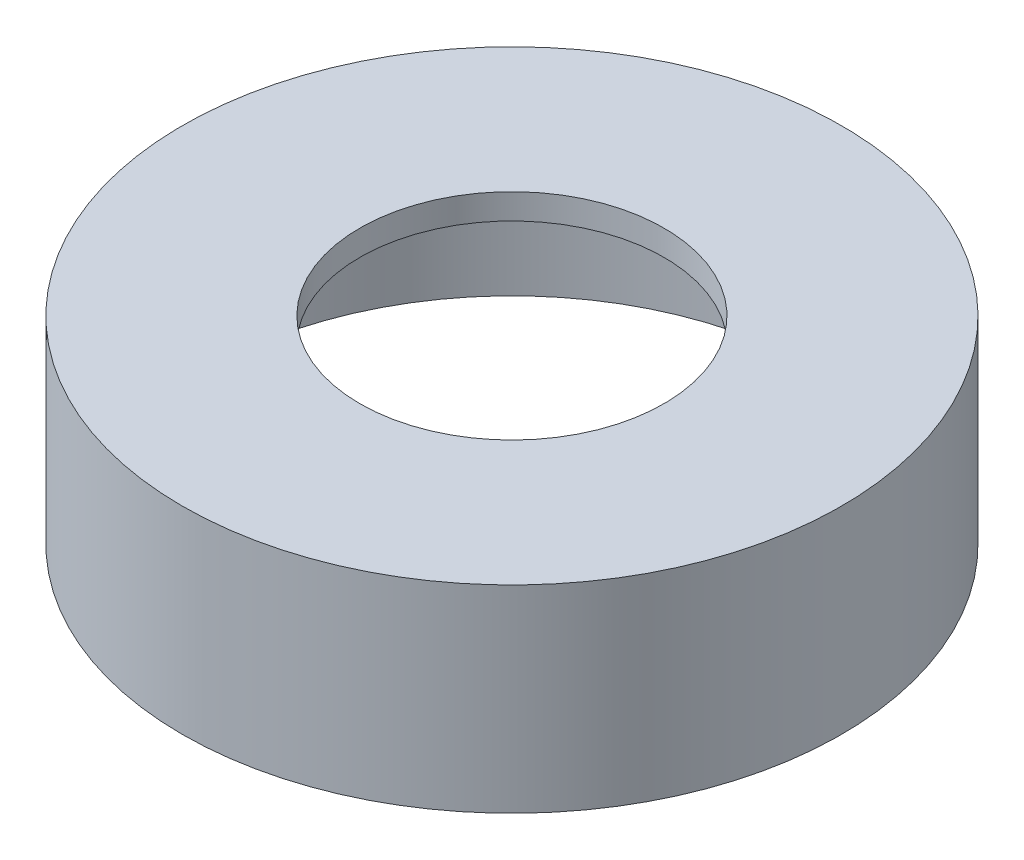
ISO-10303-21;
HEADER;
FILE_DESCRIPTION(('STEP AP214'),'2;1');
FILE_NAME('part.step','',(''),(''),'','','');
FILE_SCHEMA(('AUTOMOTIVE_DESIGN { 1 0 10303 214 1 1 1 1 }'));
ENDSEC;
DATA;
#1=APPLICATION_CONTEXT('core data for automotive mechanical design processes');
#2=APPLICATION_PROTOCOL_DEFINITION('international standard','automotive_design',2000,#1);
#3=PRODUCT_CONTEXT('',#1,'mechanical');
#4=PRODUCT('Part','Part','',(#3));
#5=PRODUCT_RELATED_PRODUCT_CATEGORY('part','',(#4));
#6=PRODUCT_DEFINITION_FORMATION('','',#4);
#7=PRODUCT_DEFINITION_CONTEXT('part definition',#1,'design');
#8=PRODUCT_DEFINITION('design','',#6,#7);
#9=PRODUCT_DEFINITION_SHAPE('','',#8);
#10=(LENGTH_UNIT() NAMED_UNIT(*) SI_UNIT(.MILLI.,.METRE.));
#11=(NAMED_UNIT(*) PLANE_ANGLE_UNIT() SI_UNIT($,.RADIAN.));
#12=(NAMED_UNIT(*) SI_UNIT($,.STERADIAN.) SOLID_ANGLE_UNIT());
#13=UNCERTAINTY_MEASURE_WITH_UNIT(LENGTH_MEASURE(1.E-05),#10,'distance_accuracy_value','');
#14=(GEOMETRIC_REPRESENTATION_CONTEXT(3) GLOBAL_UNCERTAINTY_ASSIGNED_CONTEXT((#13)) GLOBAL_UNIT_ASSIGNED_CONTEXT((#10,
#11,#12)) REPRESENTATION_CONTEXT('',''));
#15=CARTESIAN_POINT('',(0.,0.,0.));
#16=DIRECTION('',(0.,0.,1.));
#17=DIRECTION('',(1.,0.,0.));
#18=AXIS2_PLACEMENT_3D('',#15,#16,#17);
#19=CARTESIAN_POINT('',(0.,19.5,0.));
#20=DIRECTION('',(0.,-1.,0.));
#21=DIRECTION('',(0.,0.,-1.));
#22=AXIS2_PLACEMENT_3D('',#19,#20,#21);
#23=CYLINDRICAL_SURFACE('',#22,30.);
#24=CARTESIAN_POINT('',(0.,17.,0.));
#25=DIRECTION('',(0.,1.,0.));
#26=DIRECTION('',(0.,0.,1.));
#27=AXIS2_PLACEMENT_3D('',#24,#25,#26);
#28=CIRCLE('',#27,30.);
#29=CARTESIAN_POINT('',(0.,17.,30.));
#30=VERTEX_POINT('',#29);
#31=EDGE_CURVE('E239',#30,#30,#28,.T.);
#32=ORIENTED_EDGE('',*,*,#31,.T.);
#33=EDGE_LOOP('',(#32));
#34=FACE_BOUND('',#33,.T.);
#35=CARTESIAN_POINT('',(0.,0.,0.));
#36=DIRECTION('',(0.,1.,0.));
#37=DIRECTION('',(0.,0.,1.));
#38=AXIS2_PLACEMENT_3D('',#35,#36,#37);
#39=CIRCLE('',#38,30.);
#40=CARTESIAN_POINT('',(0.,0.,30.));
#41=VERTEX_POINT('',#40);
#42=EDGE_CURVE('E243',#41,#41,#39,.T.);
#43=ORIENTED_EDGE('',*,*,#42,.F.);
#44=EDGE_LOOP('',(#43));
#45=FACE_BOUND('',#44,.T.);
#46=CARTESIAN_POINT('',(0.,4.,0.));
#47=DIRECTION('',(0.,1.,0.));
#48=DIRECTION('',(0.,0.,1.));
#49=AXIS2_PLACEMENT_3D('',#46,#47,#48);
#50=CIRCLE('',#49,30.);
#51=CARTESIAN_POINT('',(-1.5,4.,29.9624765331573));
#52=VERTEX_POINT('',#51);
#53=CARTESIAN_POINT('',(1.5,4.,29.9624765331573));
#54=VERTEX_POINT('',#53);
#55=EDGE_CURVE('E258',#52,#54,#50,.T.);
#56=ORIENTED_EDGE('',*,*,#55,.T.);
#57=DIRECTION('',(0.,-1.,0.));
#58=VECTOR('',#57,1.);
#59=CARTESIAN_POINT('',(1.5,19.5,29.9624765331573));
#60=LINE('',#59,#58);
#61=CARTESIAN_POINT('',(1.5,7.96050161384976,29.9624765331573));
#62=VERTEX_POINT('',#61);
#63=EDGE_CURVE('E260',#54,#62,#60,.F.);
#64=ORIENTED_EDGE('',*,*,#63,.T.);
#65=CARTESIAN_POINT('',(0.,-23.5789473684211,0.));
#66=DIRECTION('',(0.,-0.688749461914693,0.724999433594414));
#67=DIRECTION('',(0.,-0.724999433594414,-0.688749461914693));
#68=AXIS2_PLACEMENT_3D('',#65,#66,#67);
#69=ELLIPSE('',#68,43.5572028130539,30.);
#70=CARTESIAN_POINT('',(-1.5,7.96050161384975,29.9624765331573));
#71=VERTEX_POINT('',#70);
#72=EDGE_CURVE('E256',#62,#71,#69,.T.);
#73=ORIENTED_EDGE('',*,*,#72,.T.);
#74=DIRECTION('',(0.,-1.,0.));
#75=VECTOR('',#74,1.);
#76=CARTESIAN_POINT('',(-1.5,19.5,29.9624765331573));
#77=LINE('',#76,#75);
#78=EDGE_CURVE('E249',#52,#71,#77,.F.);
#79=ORIENTED_EDGE('',*,*,#78,.F.);
#80=EDGE_LOOP('',(#56,#64,#73,#79));
#81=FACE_BOUND('',#80,.T.);
#82=CARTESIAN_POINT('',(0.,4.,0.));
#83=DIRECTION('',(0.,1.,0.));
#84=DIRECTION('',(0.,0.,1.));
#85=AXIS2_PLACEMENT_3D('',#82,#83,#84);
#86=CIRCLE('',#85,30.);
#87=CARTESIAN_POINT('',(29.9624765331573,4.,1.4999999999999));
#88=VERTEX_POINT('',#87);
#89=CARTESIAN_POINT('',(29.9624765331573,4.,-1.5000000000001));
#90=VERTEX_POINT('',#89);
#91=EDGE_CURVE('E268',#88,#90,#86,.T.);
#92=ORIENTED_EDGE('',*,*,#91,.T.);
#93=DIRECTION('',(0.,-1.,0.));
#94=VECTOR('',#93,1.);
#95=CARTESIAN_POINT('',(29.9624765331573,19.5,-1.5000000000001));
#96=LINE('',#95,#94);
#97=CARTESIAN_POINT('',(29.9624765331573,7.96050161384976,-1.5000000000001));
#98=VERTEX_POINT('',#97);
#99=EDGE_CURVE('E270',#90,#98,#96,.F.);
#100=ORIENTED_EDGE('',*,*,#99,.T.);
#101=CARTESIAN_POINT('',(0.,-23.5789473684211,0.));
#102=DIRECTION('',(0.724999433594414,-0.688749461914693,0.));
#103=DIRECTION('',(-0.688749461914693,-0.724999433594414,0.));
#104=AXIS2_PLACEMENT_3D('',#101,#102,#103);
#105=ELLIPSE('',#104,43.5572028130539,30.);
#106=CARTESIAN_POINT('',(29.9624765331573,7.96050161384975,1.4999999999999));
#107=VERTEX_POINT('',#106);
#108=EDGE_CURVE('E266',#98,#107,#105,.T.);
#109=ORIENTED_EDGE('',*,*,#108,.T.);
#110=DIRECTION('',(0.,-1.,0.));
#111=VECTOR('',#110,1.);
#112=CARTESIAN_POINT('',(29.9624765331573,19.5,1.4999999999999));
#113=LINE('',#112,#111);
#114=EDGE_CURVE('E263',#88,#107,#113,.F.);
#115=ORIENTED_EDGE('',*,*,#114,.F.);
#116=EDGE_LOOP('',(#92,#100,#109,#115));
#117=FACE_BOUND('',#116,.T.);
#118=CARTESIAN_POINT('',(0.,4.,0.));
#119=DIRECTION('',(0.,1.,0.));
#120=DIRECTION('',(0.,0.,1.));
#121=AXIS2_PLACEMENT_3D('',#118,#119,#120);
#122=CIRCLE('',#121,30.);
#123=CARTESIAN_POINT('',(1.5,4.,-29.9624765331573));
#124=VERTEX_POINT('',#123);
#125=CARTESIAN_POINT('',(-1.5,4.,-29.9624765331573));
#126=VERTEX_POINT('',#125);
#127=EDGE_CURVE('E278',#124,#126,#122,.T.);
#128=ORIENTED_EDGE('',*,*,#127,.T.);
#129=DIRECTION('',(0.,-1.,0.));
#130=VECTOR('',#129,1.);
#131=CARTESIAN_POINT('',(-1.5,19.5,-29.9624765331573));
#132=LINE('',#131,#130);
#133=CARTESIAN_POINT('',(-1.5,7.96050161384976,-29.9624765331573));
#134=VERTEX_POINT('',#133);
#135=EDGE_CURVE('E280',#126,#134,#132,.F.);
#136=ORIENTED_EDGE('',*,*,#135,.T.);
#137=CARTESIAN_POINT('',(0.,-23.5789473684211,0.));
#138=DIRECTION('',(0.,-0.688749461914693,-0.724999433594414));
#139=DIRECTION('',(0.,-0.724999433594414,0.688749461914693));
#140=AXIS2_PLACEMENT_3D('',#137,#138,#139);
#141=ELLIPSE('',#140,43.5572028130539,30.);
#142=CARTESIAN_POINT('',(1.5,7.96050161384975,-29.9624765331573));
#143=VERTEX_POINT('',#142);
#144=EDGE_CURVE('E276',#134,#143,#141,.T.);
#145=ORIENTED_EDGE('',*,*,#144,.T.);
#146=DIRECTION('',(0.,-1.,0.));
#147=VECTOR('',#146,1.);
#148=CARTESIAN_POINT('',(1.5,19.5,-29.9624765331573));
#149=LINE('',#148,#147);
#150=EDGE_CURVE('E273',#124,#143,#149,.F.);
#151=ORIENTED_EDGE('',*,*,#150,.F.);
#152=EDGE_LOOP('',(#128,#136,#145,#151));
#153=FACE_BOUND('',#152,.T.);
#154=CARTESIAN_POINT('',(0.,4.,0.));
#155=DIRECTION('',(0.,1.,0.));
#156=DIRECTION('',(0.,0.,1.));
#157=AXIS2_PLACEMENT_3D('',#154,#155,#156);
#158=CIRCLE('',#157,30.);
#159=CARTESIAN_POINT('',(-29.9624765331573,4.,-1.49999999999969));
#160=VERTEX_POINT('',#159);
#161=CARTESIAN_POINT('',(-29.9624765331572,4.,1.50000000000031));
#162=VERTEX_POINT('',#161);
#163=EDGE_CURVE('E42',#160,#162,#158,.T.);
#164=ORIENTED_EDGE('',*,*,#163,.T.);
#165=DIRECTION('',(0.,-1.,0.));
#166=VECTOR('',#165,1.);
#167=CARTESIAN_POINT('',(-29.9624765331572,19.5,1.50000000000031));
#168=LINE('',#167,#166);
#169=CARTESIAN_POINT('',(-29.9624765331573,7.96050161384976,1.50000000000031));
#170=VERTEX_POINT('',#169);
#171=EDGE_CURVE('E11',#162,#170,#168,.F.);
#172=ORIENTED_EDGE('',*,*,#171,.T.);
#173=CARTESIAN_POINT('',(0.,-23.5789473684211,0.));
#174=DIRECTION('',(-0.724999433594414,-0.688749461914693,0.));
#175=DIRECTION('',(0.688749461914693,-0.724999433594414,0.));
#176=AXIS2_PLACEMENT_3D('',#173,#174,#175);
#177=ELLIPSE('',#176,43.5572028130539,30.);
#178=CARTESIAN_POINT('',(-29.9624765331573,7.96050161384975,-1.49999999999969));
#179=VERTEX_POINT('',#178);
#180=EDGE_CURVE('E55',#170,#179,#177,.T.);
#181=ORIENTED_EDGE('',*,*,#180,.T.);
#182=DIRECTION('',(0.,-1.,0.));
#183=VECTOR('',#182,1.);
#184=CARTESIAN_POINT('',(-29.9624765331573,19.5,-1.49999999999969));
#185=LINE('',#184,#183);
#186=EDGE_CURVE('E283',#160,#179,#185,.F.);
#187=ORIENTED_EDGE('',*,*,#186,.F.);
#188=EDGE_LOOP('',(#164,#172,#181,#187));
#189=FACE_BOUND('',#188,.T.);
#190=ADVANCED_FACE('F34',(#34,#45,#81,#117,#153,#189),#23,.F.);
#191=CARTESIAN_POINT('',(0.,19.5,0.));
#192=DIRECTION('',(0.,-1.,0.));
#193=DIRECTION('',(0.,0.,-1.));
#194=AXIS2_PLACEMENT_3D('',#191,#192,#193);
#195=CYLINDRICAL_SURFACE('',#194,32.5);
#196=CARTESIAN_POINT('',(0.,19.5,0.));
#197=DIRECTION('',(0.,1.,0.));
#198=DIRECTION('',(0.,0.,1.));
#199=AXIS2_PLACEMENT_3D('',#196,#197,#198);
#200=CIRCLE('',#199,32.5);
#201=CARTESIAN_POINT('',(0.,19.5,32.5));
#202=VERTEX_POINT('',#201);
#203=EDGE_CURVE('E246',#202,#202,#200,.T.);
#204=ORIENTED_EDGE('',*,*,#203,.F.);
#205=EDGE_LOOP('',(#204));
#206=FACE_BOUND('',#205,.T.);
#207=CARTESIAN_POINT('',(0.,0.,0.));
#208=DIRECTION('',(0.,1.,0.));
#209=DIRECTION('',(0.,0.,1.));
#210=AXIS2_PLACEMENT_3D('',#207,#208,#209);
#211=CIRCLE('',#210,32.5);
#212=CARTESIAN_POINT('',(0.,0.,32.5));
#213=VERTEX_POINT('',#212);
#214=EDGE_CURVE('E242',#213,#213,#211,.T.);
#215=ORIENTED_EDGE('',*,*,#214,.T.);
#216=EDGE_LOOP('',(#215));
#217=FACE_BOUND('',#216,.T.);
#218=ADVANCED_FACE('F36',(#206,#217),#195,.T.);
#219=CARTESIAN_POINT('',(0.,19.5,0.));
#220=DIRECTION('',(0.,1.,0.));
#221=DIRECTION('',(0.,0.,1.));
#222=AXIS2_PLACEMENT_3D('',#219,#220,#221);
#223=PLANE('',#222);
#224=CARTESIAN_POINT('',(0.,19.5,0.));
#225=DIRECTION('',(0.,1.,0.));
#226=DIRECTION('',(0.,0.,1.));
#227=AXIS2_PLACEMENT_3D('',#224,#225,#226);
#228=CIRCLE('',#227,15.);
#229=CARTESIAN_POINT('',(0.,19.5,15.));
#230=VERTEX_POINT('',#229);
#231=EDGE_CURVE('E235',#230,#230,#228,.T.);
#232=ORIENTED_EDGE('',*,*,#231,.F.);
#233=EDGE_LOOP('',(#232));
#234=FACE_BOUND('',#233,.T.);
#235=ORIENTED_EDGE('',*,*,#203,.T.);
#236=EDGE_LOOP('',(#235));
#237=FACE_BOUND('',#236,.T.);
#238=ADVANCED_FACE('F306',(#234,#237),#223,.T.);
#239=CARTESIAN_POINT('',(0.,0.,0.));
#240=DIRECTION('',(0.,1.,0.));
#241=DIRECTION('',(0.,0.,1.));
#242=AXIS2_PLACEMENT_3D('',#239,#240,#241);
#243=PLANE('',#242);
#244=ORIENTED_EDGE('',*,*,#42,.T.);
#245=EDGE_LOOP('',(#244));
#246=FACE_BOUND('',#245,.T.);
#247=ORIENTED_EDGE('',*,*,#214,.F.);
#248=EDGE_LOOP('',(#247));
#249=FACE_BOUND('',#248,.T.);
#250=ADVANCED_FACE('F316',(#246,#249),#243,.F.);
#251=CARTESIAN_POINT('',(0.,17.,0.));
#252=DIRECTION('',(0.,1.,0.));
#253=DIRECTION('',(0.,0.,1.));
#254=AXIS2_PLACEMENT_3D('',#251,#252,#253);
#255=PLANE('',#254);
#256=CARTESIAN_POINT('',(0.,17.,0.));
#257=DIRECTION('',(0.,1.,0.));
#258=DIRECTION('',(0.,0.,1.));
#259=AXIS2_PLACEMENT_3D('',#256,#257,#258);
#260=CIRCLE('',#259,15.);
#261=CARTESIAN_POINT('',(0.,17.,15.));
#262=VERTEX_POINT('',#261);
#263=EDGE_CURVE('E238',#262,#262,#260,.T.);
#264=ORIENTED_EDGE('',*,*,#263,.T.);
#265=EDGE_LOOP('',(#264));
#266=FACE_BOUND('',#265,.T.);
#267=ORIENTED_EDGE('',*,*,#31,.F.);
#268=EDGE_LOOP('',(#267));
#269=FACE_BOUND('',#268,.T.);
#270=ADVANCED_FACE('F313',(#266,#269),#255,.F.);
#271=CARTESIAN_POINT('',(0.,0.,0.));
#272=DIRECTION('',(0.,1.,0.));
#273=DIRECTION('',(0.,0.,1.));
#274=AXIS2_PLACEMENT_3D('',#271,#272,#273);
#275=CYLINDRICAL_SURFACE('',#274,15.);
#276=ORIENTED_EDGE('',*,*,#231,.T.);
#277=EDGE_LOOP('',(#276));
#278=FACE_BOUND('',#277,.T.);
#279=ORIENTED_EDGE('',*,*,#263,.F.);
#280=EDGE_LOOP('',(#279));
#281=FACE_BOUND('',#280,.T.);
#282=ADVANCED_FACE('F311',(#278,#281),#275,.F.);
#283=CARTESIAN_POINT('',(1.5,4.,30.));
#284=DIRECTION('',(0.,1.,0.));
#285=DIRECTION('',(0.,0.,1.));
#286=AXIS2_PLACEMENT_3D('',#283,#284,#285);
#287=PLANE('',#286);
#288=DIRECTION('',(0.,0.,-1.));
#289=VECTOR('',#288,1.);
#290=CARTESIAN_POINT('',(1.5,4.,30.));
#291=LINE('',#290,#289);
#292=CARTESIAN_POINT('',(1.5,4.,28.1));
#293=VERTEX_POINT('',#292);
#294=EDGE_CURVE('E216',#54,#293,#291,.T.);
#295=ORIENTED_EDGE('',*,*,#294,.F.);
#296=ORIENTED_EDGE('',*,*,#55,.F.);
#297=DIRECTION('',(0.,0.,-1.));
#298=VECTOR('',#297,1.);
#299=CARTESIAN_POINT('',(-1.5,4.,30.));
#300=LINE('',#299,#298);
#301=CARTESIAN_POINT('',(-1.5,4.,28.1));
#302=VERTEX_POINT('',#301);
#303=EDGE_CURVE('E215',#52,#302,#300,.T.);
#304=ORIENTED_EDGE('',*,*,#303,.T.);
#305=DIRECTION('',(-1.,0.,0.));
#306=VECTOR('',#305,1.);
#307=CARTESIAN_POINT('',(1.5,4.,28.1));
#308=LINE('',#307,#306);
#309=EDGE_CURVE('E232',#293,#302,#308,.T.);
#310=ORIENTED_EDGE('',*,*,#309,.F.);
#311=EDGE_LOOP('',(#295,#296,#304,#310));
#312=FACE_BOUND('',#311,.T.);
#313=ADVANCED_FACE('F399',(#312),#287,.F.);
#314=CARTESIAN_POINT('',(1.5,8.,30.));
#315=DIRECTION('',(0.,-0.688749461914693,0.724999433594414));
#316=DIRECTION('',(0.,-0.724999433594414,-0.688749461914693));
#317=AXIS2_PLACEMENT_3D('',#314,#315,#316);
#318=PLANE('',#317);
#319=ORIENTED_EDGE('',*,*,#72,.F.);
#320=DIRECTION('',(0.,0.724999433594414,0.688749461914693));
#321=VECTOR('',#320,1.);
#322=CARTESIAN_POINT('',(1.5,8.,30.));
#323=LINE('',#322,#321);
#324=CARTESIAN_POINT('',(1.5,6.,28.1));
#325=VERTEX_POINT('',#324);
#326=EDGE_CURVE('E221',#325,#62,#323,.T.);
#327=ORIENTED_EDGE('',*,*,#326,.F.);
#328=DIRECTION('',(-1.,0.,0.));
#329=VECTOR('',#328,1.);
#330=CARTESIAN_POINT('',(1.5,6.,28.1));
#331=LINE('',#330,#329);
#332=CARTESIAN_POINT('',(-1.5,6.,28.1));
#333=VERTEX_POINT('',#332);
#334=EDGE_CURVE('E224',#325,#333,#331,.T.);
#335=ORIENTED_EDGE('',*,*,#334,.T.);
#336=DIRECTION('',(0.,0.724999433594414,0.688749461914693));
#337=VECTOR('',#336,1.);
#338=CARTESIAN_POINT('',(-1.5,8.,30.));
#339=LINE('',#338,#337);
#340=EDGE_CURVE('E219',#333,#71,#339,.T.);
#341=ORIENTED_EDGE('',*,*,#340,.T.);
#342=EDGE_LOOP('',(#319,#327,#335,#341));
#343=FACE_BOUND('',#342,.T.);
#344=ADVANCED_FACE('F396',(#343),#318,.F.);
#345=CARTESIAN_POINT('',(1.5,4.,28.1));
#346=DIRECTION('',(0.,0.,1.));
#347=DIRECTION('',(1.,0.,0.));
#348=AXIS2_PLACEMENT_3D('',#345,#346,#347);
#349=PLANE('',#348);
#350=DIRECTION('',(0.,1.,0.));
#351=VECTOR('',#350,1.);
#352=CARTESIAN_POINT('',(-1.5,4.,28.1));
#353=LINE('',#352,#351);
#354=EDGE_CURVE('E226',#302,#333,#353,.T.);
#355=ORIENTED_EDGE('',*,*,#354,.T.);
#356=ORIENTED_EDGE('',*,*,#334,.F.);
#357=DIRECTION('',(0.,1.,0.));
#358=VECTOR('',#357,1.);
#359=CARTESIAN_POINT('',(1.5,4.,28.1));
#360=LINE('',#359,#358);
#361=EDGE_CURVE('E218',#293,#325,#360,.T.);
#362=ORIENTED_EDGE('',*,*,#361,.F.);
#363=ORIENTED_EDGE('',*,*,#309,.T.);
#364=EDGE_LOOP('',(#355,#356,#362,#363));
#365=FACE_BOUND('',#364,.T.);
#366=ADVANCED_FACE('F391',(#365),#349,.F.);
#367=CARTESIAN_POINT('',(1.5,0.,0.));
#368=DIRECTION('',(-1.,0.,0.));
#369=DIRECTION('',(0.,0.,1.));
#370=AXIS2_PLACEMENT_3D('',#367,#368,#369);
#371=PLANE('',#370);
#372=ORIENTED_EDGE('',*,*,#63,.F.);
#373=ORIENTED_EDGE('',*,*,#294,.T.);
#374=ORIENTED_EDGE('',*,*,#361,.T.);
#375=ORIENTED_EDGE('',*,*,#326,.T.);
#376=EDGE_LOOP('',(#372,#373,#374,#375));
#377=FACE_BOUND('',#376,.T.);
#378=ADVANCED_FACE('F388',(#377),#371,.F.);
#379=CARTESIAN_POINT('',(-1.5,0.,0.));
#380=DIRECTION('',(-1.,0.,0.));
#381=DIRECTION('',(0.,0.,1.));
#382=AXIS2_PLACEMENT_3D('',#379,#380,#381);
#383=PLANE('',#382);
#384=ORIENTED_EDGE('',*,*,#303,.F.);
#385=ORIENTED_EDGE('',*,*,#78,.T.);
#386=ORIENTED_EDGE('',*,*,#340,.F.);
#387=ORIENTED_EDGE('',*,*,#354,.F.);
#388=EDGE_LOOP('',(#384,#385,#386,#387));
#389=FACE_BOUND('',#388,.T.);
#390=ADVANCED_FACE('F386',(#389),#383,.T.);
#391=CARTESIAN_POINT('',(30.,4.,-1.5000000000001));
#392=DIRECTION('',(0.,1.,0.));
#393=DIRECTION('',(0.,0.,1.));
#394=AXIS2_PLACEMENT_3D('',#391,#392,#393);
#395=PLANE('',#394);
#396=ORIENTED_EDGE('',*,*,#91,.F.);
#397=DIRECTION('',(-1.,0.,0.));
#398=VECTOR('',#397,1.);
#399=CARTESIAN_POINT('',(30.,4.,1.4999999999999));
#400=LINE('',#399,#398);
#401=CARTESIAN_POINT('',(28.1,4.,1.4999999999999));
#402=VERTEX_POINT('',#401);
#403=EDGE_CURVE('E195',#88,#402,#400,.T.);
#404=ORIENTED_EDGE('',*,*,#403,.T.);
#405=DIRECTION('',(0.,0.,1.));
#406=VECTOR('',#405,1.);
#407=CARTESIAN_POINT('',(28.1,4.,-1.5000000000001));
#408=LINE('',#407,#406);
#409=CARTESIAN_POINT('',(28.1,4.,-1.5000000000001));
#410=VERTEX_POINT('',#409);
#411=EDGE_CURVE('E212',#410,#402,#408,.T.);
#412=ORIENTED_EDGE('',*,*,#411,.F.);
#413=DIRECTION('',(-1.,0.,0.));
#414=VECTOR('',#413,1.);
#415=CARTESIAN_POINT('',(30.,4.,-1.5000000000001));
#416=LINE('',#415,#414);
#417=EDGE_CURVE('E196',#90,#410,#416,.T.);
#418=ORIENTED_EDGE('',*,*,#417,.F.);
#419=EDGE_LOOP('',(#396,#404,#412,#418));
#420=FACE_BOUND('',#419,.T.);
#421=ADVANCED_FACE('F379',(#420),#395,.F.);
#422=CARTESIAN_POINT('',(30.,8.,-1.5000000000001));
#423=DIRECTION('',(0.724999433594414,-0.688749461914693,0.));
#424=DIRECTION('',(0.688749461914693,0.724999433594414,0.));
#425=AXIS2_PLACEMENT_3D('',#422,#423,#424);
#426=PLANE('',#425);
#427=ORIENTED_EDGE('',*,*,#108,.F.);
#428=DIRECTION('',(0.688749461914693,0.724999433594414,0.));
#429=VECTOR('',#428,1.);
#430=CARTESIAN_POINT('',(30.,8.,-1.5000000000001));
#431=LINE('',#430,#429);
#432=CARTESIAN_POINT('',(28.1,6.,-1.5000000000001));
#433=VERTEX_POINT('',#432);
#434=EDGE_CURVE('E201',#433,#98,#431,.T.);
#435=ORIENTED_EDGE('',*,*,#434,.F.);
#436=DIRECTION('',(0.,0.,1.));
#437=VECTOR('',#436,1.);
#438=CARTESIAN_POINT('',(28.1,6.,-1.5000000000001));
#439=LINE('',#438,#437);
#440=CARTESIAN_POINT('',(28.1,6.,1.4999999999999));
#441=VERTEX_POINT('',#440);
#442=EDGE_CURVE('E204',#433,#441,#439,.T.);
#443=ORIENTED_EDGE('',*,*,#442,.T.);
#444=DIRECTION('',(0.688749461914693,0.724999433594414,0.));
#445=VECTOR('',#444,1.);
#446=CARTESIAN_POINT('',(30.,8.,1.4999999999999));
#447=LINE('',#446,#445);
#448=EDGE_CURVE('E199',#441,#107,#447,.T.);
#449=ORIENTED_EDGE('',*,*,#448,.T.);
#450=EDGE_LOOP('',(#427,#435,#443,#449));
#451=FACE_BOUND('',#450,.T.);
#452=ADVANCED_FACE('F376',(#451),#426,.F.);
#453=CARTESIAN_POINT('',(28.1,4.,-1.5000000000001));
#454=DIRECTION('',(1.,0.,0.));
#455=DIRECTION('',(0.,0.,-1.));
#456=AXIS2_PLACEMENT_3D('',#453,#454,#455);
#457=PLANE('',#456);
#458=DIRECTION('',(0.,1.,0.));
#459=VECTOR('',#458,1.);
#460=CARTESIAN_POINT('',(28.1,4.,1.4999999999999));
#461=LINE('',#460,#459);
#462=EDGE_CURVE('E206',#402,#441,#461,.T.);
#463=ORIENTED_EDGE('',*,*,#462,.T.);
#464=ORIENTED_EDGE('',*,*,#442,.F.);
#465=DIRECTION('',(0.,1.,0.));
#466=VECTOR('',#465,1.);
#467=CARTESIAN_POINT('',(28.1,4.,-1.5000000000001));
#468=LINE('',#467,#466);
#469=EDGE_CURVE('E198',#410,#433,#468,.T.);
#470=ORIENTED_EDGE('',*,*,#469,.F.);
#471=ORIENTED_EDGE('',*,*,#411,.T.);
#472=EDGE_LOOP('',(#463,#464,#470,#471));
#473=FACE_BOUND('',#472,.T.);
#474=ADVANCED_FACE('F371',(#473),#457,.F.);
#475=CARTESIAN_POINT('',(0.,0.,-1.5));
#476=DIRECTION('',(0.,0.,1.));
#477=DIRECTION('',(1.,0.,0.));
#478=AXIS2_PLACEMENT_3D('',#475,#476,#477);
#479=PLANE('',#478);
#480=ORIENTED_EDGE('',*,*,#99,.F.);
#481=ORIENTED_EDGE('',*,*,#417,.T.);
#482=ORIENTED_EDGE('',*,*,#469,.T.);
#483=ORIENTED_EDGE('',*,*,#434,.T.);
#484=EDGE_LOOP('',(#480,#481,#482,#483));
#485=FACE_BOUND('',#484,.T.);
#486=ADVANCED_FACE('F368',(#485),#479,.F.);
#487=CARTESIAN_POINT('',(0.,0.,1.5));
#488=DIRECTION('',(0.,0.,1.));
#489=DIRECTION('',(1.,0.,0.));
#490=AXIS2_PLACEMENT_3D('',#487,#488,#489);
#491=PLANE('',#490);
#492=ORIENTED_EDGE('',*,*,#403,.F.);
#493=ORIENTED_EDGE('',*,*,#114,.T.);
#494=ORIENTED_EDGE('',*,*,#448,.F.);
#495=ORIENTED_EDGE('',*,*,#462,.F.);
#496=EDGE_LOOP('',(#492,#493,#494,#495));
#497=FACE_BOUND('',#496,.T.);
#498=ADVANCED_FACE('F367',(#497),#491,.T.);
#499=CARTESIAN_POINT('',(-1.5,4.,-30.));
#500=DIRECTION('',(0.,1.,0.));
#501=DIRECTION('',(0.,0.,1.));
#502=AXIS2_PLACEMENT_3D('',#499,#500,#501);
#503=PLANE('',#502);
#504=ORIENTED_EDGE('',*,*,#127,.F.);
#505=DIRECTION('',(0.,0.,1.));
#506=VECTOR('',#505,1.);
#507=CARTESIAN_POINT('',(1.5,4.,-30.));
#508=LINE('',#507,#506);
#509=CARTESIAN_POINT('',(1.5,4.,-28.1));
#510=VERTEX_POINT('',#509);
#511=EDGE_CURVE('E162',#124,#510,#508,.T.);
#512=ORIENTED_EDGE('',*,*,#511,.T.);
#513=DIRECTION('',(1.,0.,0.));
#514=VECTOR('',#513,1.);
#515=CARTESIAN_POINT('',(-1.5,4.,-28.1));
#516=LINE('',#515,#514);
#517=CARTESIAN_POINT('',(-1.5,4.,-28.1));
#518=VERTEX_POINT('',#517);
#519=EDGE_CURVE('E192',#518,#510,#516,.T.);
#520=ORIENTED_EDGE('',*,*,#519,.F.);
#521=DIRECTION('',(0.,0.,1.));
#522=VECTOR('',#521,1.);
#523=CARTESIAN_POINT('',(-1.5,4.,-30.));
#524=LINE('',#523,#522);
#525=EDGE_CURVE('E176',#126,#518,#524,.T.);
#526=ORIENTED_EDGE('',*,*,#525,.F.);
#527=EDGE_LOOP('',(#504,#512,#520,#526));
#528=FACE_BOUND('',#527,.T.);
#529=ADVANCED_FACE('F344',(#528),#503,.F.);
#530=CARTESIAN_POINT('',(-1.5,8.,-30.));
#531=DIRECTION('',(0.,-0.688749461914693,-0.724999433594414));
#532=DIRECTION('',(0.,0.724999433594414,-0.688749461914693));
#533=AXIS2_PLACEMENT_3D('',#530,#531,#532);
#534=PLANE('',#533);
#535=ORIENTED_EDGE('',*,*,#144,.F.);
#536=DIRECTION('',(0.,0.724999433594414,-0.688749461914693));
#537=VECTOR('',#536,1.);
#538=CARTESIAN_POINT('',(-1.5,8.,-30.));
#539=LINE('',#538,#537);
#540=CARTESIAN_POINT('',(-1.5,6.,-28.1));
#541=VERTEX_POINT('',#540);
#542=EDGE_CURVE('E181',#541,#134,#539,.T.);
#543=ORIENTED_EDGE('',*,*,#542,.F.);
#544=DIRECTION('',(1.,0.,0.));
#545=VECTOR('',#544,1.);
#546=CARTESIAN_POINT('',(-1.5,6.,-28.1));
#547=LINE('',#546,#545);
#548=CARTESIAN_POINT('',(1.5,6.,-28.1));
#549=VERTEX_POINT('',#548);
#550=EDGE_CURVE('E184',#541,#549,#547,.T.);
#551=ORIENTED_EDGE('',*,*,#550,.T.);
#552=DIRECTION('',(0.,0.724999433594414,-0.688749461914693));
#553=VECTOR('',#552,1.);
#554=CARTESIAN_POINT('',(1.5,8.,-30.));
#555=LINE('',#554,#553);
#556=EDGE_CURVE('E179',#549,#143,#555,.T.);
#557=ORIENTED_EDGE('',*,*,#556,.T.);
#558=EDGE_LOOP('',(#535,#543,#551,#557));
#559=FACE_BOUND('',#558,.T.);
#560=ADVANCED_FACE('F352',(#559),#534,.F.);
#561=CARTESIAN_POINT('',(-1.5,4.,-28.1));
#562=DIRECTION('',(0.,0.,-1.));
#563=DIRECTION('',(-1.,0.,0.));
#564=AXIS2_PLACEMENT_3D('',#561,#562,#563);
#565=PLANE('',#564);
#566=DIRECTION('',(0.,1.,0.));
#567=VECTOR('',#566,1.);
#568=CARTESIAN_POINT('',(1.5,4.,-28.1));
#569=LINE('',#568,#567);
#570=EDGE_CURVE('E186',#510,#549,#569,.T.);
#571=ORIENTED_EDGE('',*,*,#570,.T.);
#572=ORIENTED_EDGE('',*,*,#550,.F.);
#573=DIRECTION('',(0.,1.,0.));
#574=VECTOR('',#573,1.);
#575=CARTESIAN_POINT('',(-1.5,4.,-28.1));
#576=LINE('',#575,#574);
#577=EDGE_CURVE('E178',#518,#541,#576,.T.);
#578=ORIENTED_EDGE('',*,*,#577,.F.);
#579=ORIENTED_EDGE('',*,*,#519,.T.);
#580=EDGE_LOOP('',(#571,#572,#578,#579));
#581=FACE_BOUND('',#580,.T.);
#582=ADVANCED_FACE('F349',(#581),#565,.F.);
#583=CARTESIAN_POINT('',(-1.5,0.,0.));
#584=DIRECTION('',(1.,0.,0.));
#585=DIRECTION('',(0.,0.,-1.));
#586=AXIS2_PLACEMENT_3D('',#583,#584,#585);
#587=PLANE('',#586);
#588=ORIENTED_EDGE('',*,*,#135,.F.);
#589=ORIENTED_EDGE('',*,*,#525,.T.);
#590=ORIENTED_EDGE('',*,*,#577,.T.);
#591=ORIENTED_EDGE('',*,*,#542,.T.);
#592=EDGE_LOOP('',(#588,#589,#590,#591));
#593=FACE_BOUND('',#592,.T.);
#594=ADVANCED_FACE('F341',(#593),#587,.F.);
#595=CARTESIAN_POINT('',(1.5,0.,0.));
#596=DIRECTION('',(1.,0.,0.));
#597=DIRECTION('',(0.,0.,-1.));
#598=AXIS2_PLACEMENT_3D('',#595,#596,#597);
#599=PLANE('',#598);
#600=ORIENTED_EDGE('',*,*,#511,.F.);
#601=ORIENTED_EDGE('',*,*,#150,.T.);
#602=ORIENTED_EDGE('',*,*,#556,.F.);
#603=ORIENTED_EDGE('',*,*,#570,.F.);
#604=EDGE_LOOP('',(#600,#601,#602,#603));
#605=FACE_BOUND('',#604,.T.);
#606=ADVANCED_FACE('F297',(#605),#599,.T.);
#607=CARTESIAN_POINT('',(-30.,4.,1.50000000000031));
#608=DIRECTION('',(0.,1.,0.));
#609=DIRECTION('',(0.,0.,1.));
#610=AXIS2_PLACEMENT_3D('',#607,#608,#609);
#611=PLANE('',#610);
#612=ORIENTED_EDGE('',*,*,#163,.F.);
#613=DIRECTION('',(1.,0.,0.));
#614=VECTOR('',#613,1.);
#615=CARTESIAN_POINT('',(-30.,4.,-1.49999999999969));
#616=LINE('',#615,#614);
#617=CARTESIAN_POINT('',(-28.1,4.,-1.49999999999971));
#618=VERTEX_POINT('',#617);
#619=EDGE_CURVE('E159',#160,#618,#616,.T.);
#620=ORIENTED_EDGE('',*,*,#619,.T.);
#621=DIRECTION('',(0.,0.,-1.));
#622=VECTOR('',#621,1.);
#623=CARTESIAN_POINT('',(-28.1,4.,1.50000000000029));
#624=LINE('',#623,#622);
#625=CARTESIAN_POINT('',(-28.1,4.,1.50000000000029));
#626=VERTEX_POINT('',#625);
#627=EDGE_CURVE('E156',#626,#618,#624,.T.);
#628=ORIENTED_EDGE('',*,*,#627,.F.);
#629=DIRECTION('',(1.,0.,0.));
#630=VECTOR('',#629,1.);
#631=CARTESIAN_POINT('',(-30.,4.,1.50000000000031));
#632=LINE('',#631,#630);
#633=EDGE_CURVE('E145',#162,#626,#632,.T.);
#634=ORIENTED_EDGE('',*,*,#633,.F.);
#635=EDGE_LOOP('',(#612,#620,#628,#634));
#636=FACE_BOUND('',#635,.T.);
#637=ADVANCED_FACE('F157',(#636),#611,.F.);
#638=CARTESIAN_POINT('',(-30.,8.,1.50000000000031));
#639=DIRECTION('',(-0.724999433594414,-0.688749461914693,0.));
#640=DIRECTION('',(0.688749461914693,-0.724999433594414,0.));
#641=AXIS2_PLACEMENT_3D('',#638,#639,#640);
#642=PLANE('',#641);
#643=ORIENTED_EDGE('',*,*,#180,.F.);
#644=DIRECTION('',(-0.688749461914693,0.724999433594414,0.));
#645=VECTOR('',#644,1.);
#646=CARTESIAN_POINT('',(-30.,8.,1.50000000000031));
#647=LINE('',#646,#645);
#648=CARTESIAN_POINT('',(-28.1,6.,1.50000000000029));
#649=VERTEX_POINT('',#648);
#650=EDGE_CURVE('E167',#649,#170,#647,.T.);
#651=ORIENTED_EDGE('',*,*,#650,.F.);
#652=DIRECTION('',(0.,0.,-1.));
#653=VECTOR('',#652,1.);
#654=CARTESIAN_POINT('',(-28.1,6.,1.50000000000029));
#655=LINE('',#654,#653);
#656=CARTESIAN_POINT('',(-28.1,6.,-1.49999999999971));
#657=VERTEX_POINT('',#656);
#658=EDGE_CURVE('E163',#649,#657,#655,.T.);
#659=ORIENTED_EDGE('',*,*,#658,.T.);
#660=DIRECTION('',(-0.688749461914693,0.724999433594414,0.));
#661=VECTOR('',#660,1.);
#662=CARTESIAN_POINT('',(-30.,8.,-1.49999999999969));
#663=LINE('',#662,#661);
#664=EDGE_CURVE('E153',#657,#179,#663,.T.);
#665=ORIENTED_EDGE('',*,*,#664,.T.);
#666=EDGE_LOOP('',(#643,#651,#659,#665));
#667=FACE_BOUND('',#666,.T.);
#668=ADVANCED_FACE('F289',(#667),#642,.F.);
#669=CARTESIAN_POINT('',(-28.1,4.,1.50000000000029));
#670=DIRECTION('',(-1.,0.,0.));
#671=DIRECTION('',(0.,0.,1.));
#672=AXIS2_PLACEMENT_3D('',#669,#670,#671);
#673=PLANE('',#672);
#674=DIRECTION('',(0.,1.,0.));
#675=VECTOR('',#674,1.);
#676=CARTESIAN_POINT('',(-28.1,4.,-1.49999999999971));
#677=LINE('',#676,#675);
#678=EDGE_CURVE('E172',#618,#657,#677,.T.);
#679=ORIENTED_EDGE('',*,*,#678,.T.);
#680=ORIENTED_EDGE('',*,*,#658,.F.);
#681=DIRECTION('',(0.,1.,0.));
#682=VECTOR('',#681,1.);
#683=CARTESIAN_POINT('',(-28.1,4.,1.50000000000029));
#684=LINE('',#683,#682);
#685=EDGE_CURVE('E150',#626,#649,#684,.T.);
#686=ORIENTED_EDGE('',*,*,#685,.F.);
#687=ORIENTED_EDGE('',*,*,#627,.T.);
#688=EDGE_LOOP('',(#679,#680,#686,#687));
#689=FACE_BOUND('',#688,.T.);
#690=ADVANCED_FACE('F165',(#689),#673,.F.);
#691=CARTESIAN_POINT('',(0.,0.,1.5));
#692=DIRECTION('',(0.,0.,-1.));
#693=DIRECTION('',(-1.,0.,0.));
#694=AXIS2_PLACEMENT_3D('',#691,#692,#693);
#695=PLANE('',#694);
#696=ORIENTED_EDGE('',*,*,#171,.F.);
#697=ORIENTED_EDGE('',*,*,#633,.T.);
#698=ORIENTED_EDGE('',*,*,#685,.T.);
#699=ORIENTED_EDGE('',*,*,#650,.T.);
#700=EDGE_LOOP('',(#696,#697,#698,#699));
#701=FACE_BOUND('',#700,.T.);
#702=ADVANCED_FACE('F147',(#701),#695,.F.);
#703=CARTESIAN_POINT('',(0.,0.,-1.5));
#704=DIRECTION('',(0.,0.,-1.));
#705=DIRECTION('',(-1.,0.,0.));
#706=AXIS2_PLACEMENT_3D('',#703,#704,#705);
#707=PLANE('',#706);
#708=ORIENTED_EDGE('',*,*,#619,.F.);
#709=ORIENTED_EDGE('',*,*,#186,.T.);
#710=ORIENTED_EDGE('',*,*,#664,.F.);
#711=ORIENTED_EDGE('',*,*,#678,.F.);
#712=EDGE_LOOP('',(#708,#709,#710,#711));
#713=FACE_BOUND('',#712,.T.);
#714=ADVANCED_FACE('F288',(#713),#707,.T.);
#715=CLOSED_SHELL('',(#190,#218,#238,#250,#270,#282,#313,#344,#366,#378,#390,#421,#452,#474,
#486,#498,#529,#560,#582,#594,#606,#637,#668,#690,#702,#714));
#716=MANIFOLD_SOLID_BREP('B2',#715);
#717=ADVANCED_BREP_SHAPE_REPRESENTATION('',(#18,#716),#14);
#718=SHAPE_DEFINITION_REPRESENTATION(#9,#717);
ENDSEC;
END-ISO-10303-21;
